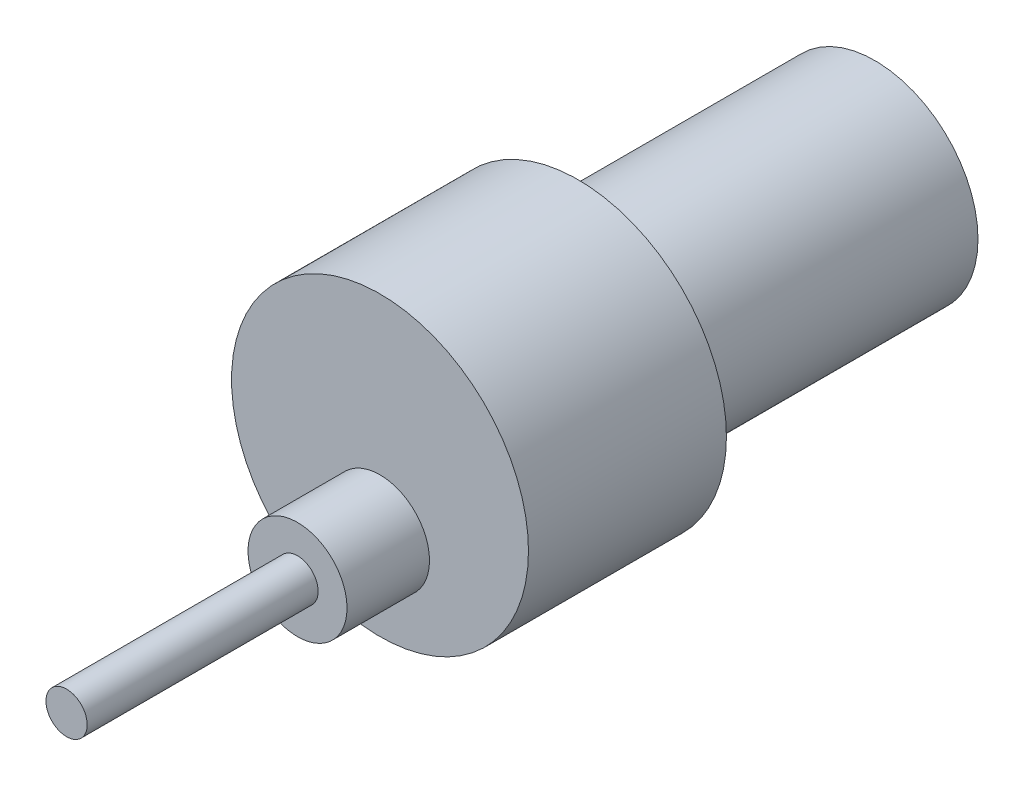
ISO-10303-21;
HEADER;
FILE_DESCRIPTION(('STEP AP214'),'2;1');
FILE_NAME('part.step','',(''),(''),'','','');
FILE_SCHEMA(('AUTOMOTIVE_DESIGN { 1 0 10303 214 1 1 1 1 }'));
ENDSEC;
DATA;
#1=APPLICATION_CONTEXT('core data for automotive mechanical design processes');
#2=APPLICATION_PROTOCOL_DEFINITION('international standard','automotive_design',2000,#1);
#3=PRODUCT_CONTEXT('',#1,'mechanical');
#4=PRODUCT('Part','Part','',(#3));
#5=PRODUCT_RELATED_PRODUCT_CATEGORY('part','',(#4));
#6=PRODUCT_DEFINITION_FORMATION('','',#4);
#7=PRODUCT_DEFINITION_CONTEXT('part definition',#1,'design');
#8=PRODUCT_DEFINITION('design','',#6,#7);
#9=PRODUCT_DEFINITION_SHAPE('','',#8);
#10=(LENGTH_UNIT() NAMED_UNIT(*) SI_UNIT(.MILLI.,.METRE.));
#11=(NAMED_UNIT(*) PLANE_ANGLE_UNIT() SI_UNIT($,.RADIAN.));
#12=(NAMED_UNIT(*) SI_UNIT($,.STERADIAN.) SOLID_ANGLE_UNIT());
#13=UNCERTAINTY_MEASURE_WITH_UNIT(LENGTH_MEASURE(1.E-05),#10,'distance_accuracy_value','');
#14=(GEOMETRIC_REPRESENTATION_CONTEXT(3) GLOBAL_UNCERTAINTY_ASSIGNED_CONTEXT((#13)) GLOBAL_UNIT_ASSIGNED_CONTEXT((#10,
#11,#12)) REPRESENTATION_CONTEXT('',''));
#15=CARTESIAN_POINT('',(0.,0.,0.));
#16=DIRECTION('',(0.,0.,1.));
#17=DIRECTION('',(1.,0.,0.));
#18=AXIS2_PLACEMENT_3D('',#15,#16,#17);
#19=CARTESIAN_POINT('',(0.,0.,36.));
#20=DIRECTION('',(0.,0.,-1.));
#21=DIRECTION('',(-1.,0.,0.));
#22=AXIS2_PLACEMENT_3D('',#19,#20,#21);
#23=CYLINDRICAL_SURFACE('',#22,12.5);
#24=CARTESIAN_POINT('',(0.,0.,36.));
#25=DIRECTION('',(0.,0.,1.));
#26=DIRECTION('',(1.,0.,0.));
#27=AXIS2_PLACEMENT_3D('',#24,#25,#26);
#28=CIRCLE('',#27,12.5);
#29=CARTESIAN_POINT('',(12.5,0.,36.));
#30=VERTEX_POINT('',#29);
#31=EDGE_CURVE('E47',#30,#30,#28,.T.);
#32=ORIENTED_EDGE('',*,*,#31,.F.);
#33=EDGE_LOOP('',(#32));
#34=FACE_BOUND('',#33,.T.);
#35=CARTESIAN_POINT('',(0.,0.,0.));
#36=DIRECTION('',(0.,0.,1.));
#37=DIRECTION('',(1.,0.,0.));
#38=AXIS2_PLACEMENT_3D('',#35,#36,#37);
#39=CIRCLE('',#38,12.5);
#40=CARTESIAN_POINT('',(12.5,0.,0.));
#41=VERTEX_POINT('',#40);
#42=EDGE_CURVE('E38',#41,#41,#39,.T.);
#43=ORIENTED_EDGE('',*,*,#42,.T.);
#44=EDGE_LOOP('',(#43));
#45=FACE_BOUND('',#44,.T.);
#46=ADVANCED_FACE('F35',(#34,#45),#23,.T.);
#47=CARTESIAN_POINT('',(0.,0.,0.));
#48=DIRECTION('',(0.,0.,1.));
#49=DIRECTION('',(1.,0.,0.));
#50=AXIS2_PLACEMENT_3D('',#47,#48,#49);
#51=PLANE('',#50);
#52=CARTESIAN_POINT('',(0.,0.,0.));
#53=DIRECTION('',(0.,0.,-1.));
#54=DIRECTION('',(-1.,0.,0.));
#55=AXIS2_PLACEMENT_3D('',#52,#53,#54);
#56=CIRCLE('',#55,5.);
#57=CARTESIAN_POINT('',(-5.,0.,0.));
#58=VERTEX_POINT('',#57);
#59=EDGE_CURVE('E42',#58,#58,#56,.T.);
#60=ORIENTED_EDGE('',*,*,#59,.F.);
#61=EDGE_LOOP('',(#60));
#62=FACE_BOUND('',#61,.T.);
#63=ORIENTED_EDGE('',*,*,#42,.F.);
#64=EDGE_LOOP('',(#63));
#65=FACE_BOUND('',#64,.T.);
#66=ADVANCED_FACE('F73',(#62,#65),#51,.F.);
#67=CARTESIAN_POINT('',(0.,0.,-4.));
#68=DIRECTION('',(0.,0.,1.));
#69=DIRECTION('',(1.,0.,0.));
#70=AXIS2_PLACEMENT_3D('',#67,#68,#69);
#71=CYLINDRICAL_SURFACE('',#70,5.);
#72=CARTESIAN_POINT('',(0.,0.,-4.));
#73=DIRECTION('',(0.,0.,-1.));
#74=DIRECTION('',(-1.,0.,0.));
#75=AXIS2_PLACEMENT_3D('',#72,#73,#74);
#76=CIRCLE('',#75,5.);
#77=CARTESIAN_POINT('',(-5.,0.,-4.));
#78=VERTEX_POINT('',#77);
#79=EDGE_CURVE('E62',#78,#78,#76,.T.);
#80=ORIENTED_EDGE('',*,*,#79,.F.);
#81=EDGE_LOOP('',(#80));
#82=FACE_BOUND('',#81,.T.);
#83=ORIENTED_EDGE('',*,*,#59,.T.);
#84=EDGE_LOOP('',(#83));
#85=FACE_BOUND('',#84,.T.);
#86=ADVANCED_FACE('F75',(#82,#85),#71,.T.);
#87=CARTESIAN_POINT('',(0.,0.,-4.));
#88=DIRECTION('',(0.,0.,-1.));
#89=DIRECTION('',(-1.,0.,0.));
#90=AXIS2_PLACEMENT_3D('',#87,#88,#89);
#91=PLANE('',#90);
#92=ORIENTED_EDGE('',*,*,#79,.T.);
#93=EDGE_LOOP('',(#92));
#94=FACE_BOUND('',#93,.T.);
#95=ADVANCED_FACE('F81',(#94),#91,.T.);
#96=CARTESIAN_POINT('',(0.,0.,60.));
#97=DIRECTION('',(0.,0.,-1.));
#98=DIRECTION('',(-1.,0.,0.));
#99=AXIS2_PLACEMENT_3D('',#96,#97,#98);
#100=CYLINDRICAL_SURFACE('',#99,18.);
#101=CARTESIAN_POINT('',(0.,0.,60.));
#102=DIRECTION('',(0.,0.,1.));
#103=DIRECTION('',(1.,0.,0.));
#104=AXIS2_PLACEMENT_3D('',#101,#102,#103);
#105=CIRCLE('',#104,18.);
#106=CARTESIAN_POINT('',(18.,0.,60.));
#107=VERTEX_POINT('',#106);
#108=EDGE_CURVE('E59',#107,#107,#105,.T.);
#109=ORIENTED_EDGE('',*,*,#108,.F.);
#110=EDGE_LOOP('',(#109));
#111=FACE_BOUND('',#110,.T.);
#112=CARTESIAN_POINT('',(0.,0.,36.));
#113=DIRECTION('',(0.,0.,1.));
#114=DIRECTION('',(1.,0.,0.));
#115=AXIS2_PLACEMENT_3D('',#112,#113,#114);
#116=CIRCLE('',#115,18.);
#117=CARTESIAN_POINT('',(18.,0.,36.));
#118=VERTEX_POINT('',#117);
#119=EDGE_CURVE('E55',#118,#118,#116,.T.);
#120=ORIENTED_EDGE('',*,*,#119,.T.);
#121=EDGE_LOOP('',(#120));
#122=FACE_BOUND('',#121,.T.);
#123=ADVANCED_FACE('F89',(#111,#122),#100,.T.);
#124=CARTESIAN_POINT('',(0.,0.,60.));
#125=DIRECTION('',(0.,0.,1.));
#126=DIRECTION('',(1.,0.,0.));
#127=AXIS2_PLACEMENT_3D('',#124,#125,#126);
#128=PLANE('',#127);
#129=CARTESIAN_POINT('',(0.,-7.,60.));
#130=DIRECTION('',(0.,0.,1.));
#131=DIRECTION('',(1.,0.,0.));
#132=AXIS2_PLACEMENT_3D('',#129,#130,#131);
#133=CIRCLE('',#132,6.);
#134=CARTESIAN_POINT('',(6.,-7.,60.));
#135=VERTEX_POINT('',#134);
#136=EDGE_CURVE('E56',#135,#135,#133,.T.);
#137=ORIENTED_EDGE('',*,*,#136,.F.);
#138=EDGE_LOOP('',(#137));
#139=FACE_BOUND('',#138,.T.);
#140=ORIENTED_EDGE('',*,*,#108,.T.);
#141=EDGE_LOOP('',(#140));
#142=FACE_BOUND('',#141,.T.);
#143=ADVANCED_FACE('F93',(#139,#142),#128,.T.);
#144=CARTESIAN_POINT('',(0.,0.,36.));
#145=DIRECTION('',(0.,0.,1.));
#146=DIRECTION('',(1.,0.,0.));
#147=AXIS2_PLACEMENT_3D('',#144,#145,#146);
#148=PLANE('',#147);
#149=ORIENTED_EDGE('',*,*,#31,.T.);
#150=EDGE_LOOP('',(#149));
#151=FACE_BOUND('',#150,.T.);
#152=ORIENTED_EDGE('',*,*,#119,.F.);
#153=EDGE_LOOP('',(#152));
#154=FACE_BOUND('',#153,.T.);
#155=ADVANCED_FACE('F95',(#151,#154),#148,.F.);
#156=CARTESIAN_POINT('',(0.,-7.,70.));
#157=DIRECTION('',(0.,0.,-1.));
#158=DIRECTION('',(-1.,0.,0.));
#159=AXIS2_PLACEMENT_3D('',#156,#157,#158);
#160=CYLINDRICAL_SURFACE('',#159,6.);
#161=CARTESIAN_POINT('',(0.,-7.,70.));
#162=DIRECTION('',(0.,0.,1.));
#163=DIRECTION('',(1.,0.,0.));
#164=AXIS2_PLACEMENT_3D('',#161,#162,#163);
#165=CIRCLE('',#164,6.);
#166=CARTESIAN_POINT('',(6.,-7.,70.));
#167=VERTEX_POINT('',#166);
#168=EDGE_CURVE('E52',#167,#167,#165,.T.);
#169=ORIENTED_EDGE('',*,*,#168,.F.);
#170=EDGE_LOOP('',(#169));
#171=FACE_BOUND('',#170,.T.);
#172=ORIENTED_EDGE('',*,*,#136,.T.);
#173=EDGE_LOOP('',(#172));
#174=FACE_BOUND('',#173,.T.);
#175=ADVANCED_FACE('F98',(#171,#174),#160,.T.);
#176=CARTESIAN_POINT('',(0.,-7.,70.));
#177=DIRECTION('',(0.,0.,1.));
#178=DIRECTION('',(1.,0.,0.));
#179=AXIS2_PLACEMENT_3D('',#176,#177,#178);
#180=PLANE('',#179);
#181=CARTESIAN_POINT('',(0.,-7.,70.));
#182=DIRECTION('',(0.,0.,1.));
#183=DIRECTION('',(1.,0.,0.));
#184=AXIS2_PLACEMENT_3D('',#181,#182,#183);
#185=CIRCLE('',#184,2.5);
#186=CARTESIAN_POINT('',(2.5,-7.,70.));
#187=VERTEX_POINT('',#186);
#188=EDGE_CURVE('E10',#187,#187,#185,.T.);
#189=ORIENTED_EDGE('',*,*,#188,.F.);
#190=EDGE_LOOP('',(#189));
#191=FACE_BOUND('',#190,.T.);
#192=ORIENTED_EDGE('',*,*,#168,.T.);
#193=EDGE_LOOP('',(#192));
#194=FACE_BOUND('',#193,.T.);
#195=ADVANCED_FACE('F104',(#191,#194),#180,.T.);
#196=CARTESIAN_POINT('',(0.,-7.,98.));
#197=DIRECTION('',(0.,0.,-1.));
#198=DIRECTION('',(-1.,0.,0.));
#199=AXIS2_PLACEMENT_3D('',#196,#197,#198);
#200=CYLINDRICAL_SURFACE('',#199,2.5);
#201=CARTESIAN_POINT('',(0.,-7.,98.));
#202=DIRECTION('',(0.,0.,1.));
#203=DIRECTION('',(1.,0.,0.));
#204=AXIS2_PLACEMENT_3D('',#201,#202,#203);
#205=CIRCLE('',#204,2.5);
#206=CARTESIAN_POINT('',(2.5,-7.,98.));
#207=VERTEX_POINT('',#206);
#208=EDGE_CURVE('E51',#207,#207,#205,.T.);
#209=ORIENTED_EDGE('',*,*,#208,.F.);
#210=EDGE_LOOP('',(#209));
#211=FACE_BOUND('',#210,.T.);
#212=ORIENTED_EDGE('',*,*,#188,.T.);
#213=EDGE_LOOP('',(#212));
#214=FACE_BOUND('',#213,.T.);
#215=ADVANCED_FACE('F108',(#211,#214),#200,.T.);
#216=CARTESIAN_POINT('',(0.,-7.,98.));
#217=DIRECTION('',(0.,0.,1.));
#218=DIRECTION('',(1.,0.,0.));
#219=AXIS2_PLACEMENT_3D('',#216,#217,#218);
#220=PLANE('',#219);
#221=ORIENTED_EDGE('',*,*,#208,.T.);
#222=EDGE_LOOP('',(#221));
#223=FACE_BOUND('',#222,.T.);
#224=ADVANCED_FACE('F112',(#223),#220,.T.);
#225=CLOSED_SHELL('',(#46,#66,#86,#95,#123,#143,#155,#175,#195,#215,#224));
#226=MANIFOLD_SOLID_BREP('B2',#225);
#227=ADVANCED_BREP_SHAPE_REPRESENTATION('',(#18,#226),#14);
#228=SHAPE_DEFINITION_REPRESENTATION(#9,#227);
ENDSEC;
END-ISO-10303-21;
